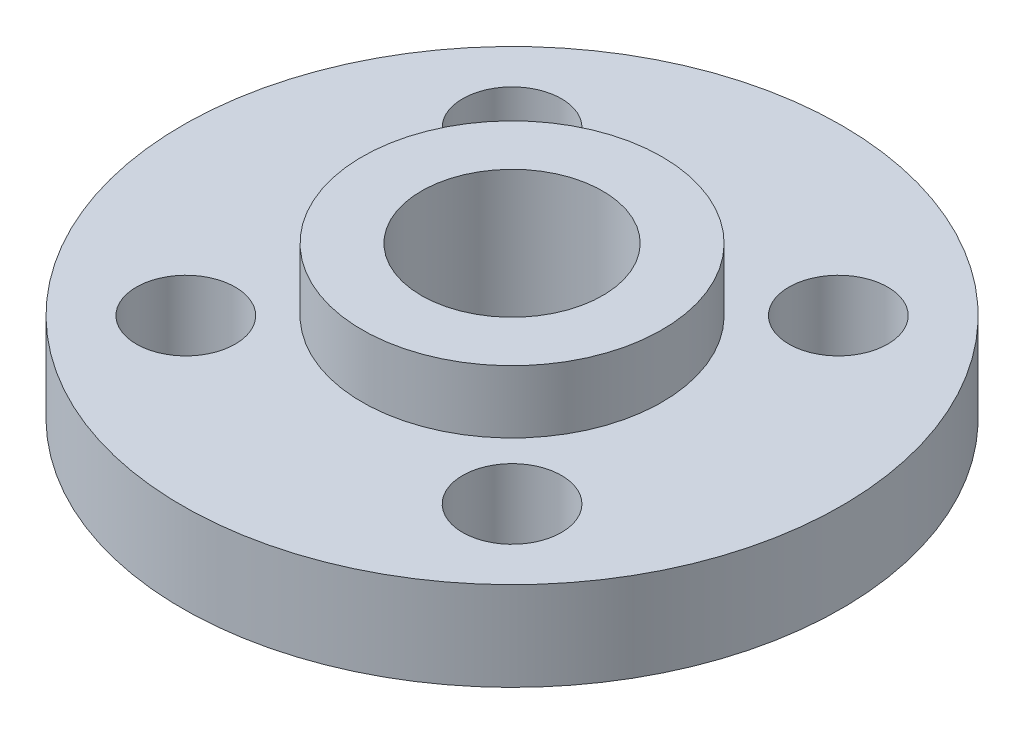
ISO-10303-21;
HEADER;
FILE_DESCRIPTION(('STEP AP214'),'2;1');
FILE_NAME('part.step','',(''),(''),'','','');
FILE_SCHEMA(('AUTOMOTIVE_DESIGN { 1 0 10303 214 1 1 1 1 }'));
ENDSEC;
DATA;
#1=APPLICATION_CONTEXT('core data for automotive mechanical design processes');
#2=APPLICATION_PROTOCOL_DEFINITION('international standard','automotive_design',2000,#1);
#3=PRODUCT_CONTEXT('',#1,'mechanical');
#4=PRODUCT('Part','Part','',(#3));
#5=PRODUCT_RELATED_PRODUCT_CATEGORY('part','',(#4));
#6=PRODUCT_DEFINITION_FORMATION('','',#4);
#7=PRODUCT_DEFINITION_CONTEXT('part definition',#1,'design');
#8=PRODUCT_DEFINITION('design','',#6,#7);
#9=PRODUCT_DEFINITION_SHAPE('','',#8);
#10=(LENGTH_UNIT() NAMED_UNIT(*) SI_UNIT(.MILLI.,.METRE.));
#11=(NAMED_UNIT(*) PLANE_ANGLE_UNIT() SI_UNIT($,.RADIAN.));
#12=(NAMED_UNIT(*) SI_UNIT($,.STERADIAN.) SOLID_ANGLE_UNIT());
#13=UNCERTAINTY_MEASURE_WITH_UNIT(LENGTH_MEASURE(1.E-05),#10,'distance_accuracy_value','');
#14=(GEOMETRIC_REPRESENTATION_CONTEXT(3) GLOBAL_UNCERTAINTY_ASSIGNED_CONTEXT((#13)) GLOBAL_UNIT_ASSIGNED_CONTEXT((#10,
#11,#12)) REPRESENTATION_CONTEXT('',''));
#15=CARTESIAN_POINT('',(0.,0.,0.));
#16=DIRECTION('',(0.,0.,1.));
#17=DIRECTION('',(1.,0.,0.));
#18=AXIS2_PLACEMENT_3D('',#15,#16,#17);
#19=CARTESIAN_POINT('',(0.,2.7,0.));
#20=DIRECTION('',(0.,-1.,0.));
#21=DIRECTION('',(0.,0.,-1.));
#22=AXIS2_PLACEMENT_3D('',#19,#20,#21);
#23=CYLINDRICAL_SURFACE('',#22,1.6);
#24=CARTESIAN_POINT('',(0.,0.,0.));
#25=DIRECTION('',(0.,1.,0.));
#26=DIRECTION('',(0.,0.,1.));
#27=AXIS2_PLACEMENT_3D('',#24,#25,#26);
#28=CIRCLE('',#27,1.6);
#29=CARTESIAN_POINT('',(0.,0.,-1.6));
#30=VERTEX_POINT('',#29);
#31=EDGE_CURVE('E43',#30,#30,#28,.T.);
#32=CARTESIAN_POINT('',(0.,0.6,0.));
#33=DIRECTION('',(0.,1.,0.));
#34=DIRECTION('',(0.,0.,1.));
#35=AXIS2_PLACEMENT_3D('',#32,#33,#34);
#36=CIRCLE('',#35,1.6);
#37=CARTESIAN_POINT('',(0.,0.599999999999999,-1.6));
#38=VERTEX_POINT('',#37);
#39=EDGE_CURVE('E34',#38,#38,#36,.T.);
#40=CARTESIAN_POINT('',(0.,0.,-1.6));
#41=CARTESIAN_POINT('',(0.,0.0062499999999996,-1.6));
#42=CARTESIAN_POINT('',(0.,0.0124999999999996,-1.6));
#43=CARTESIAN_POINT('',(0.,0.0249999999999997,-1.6));
#44=CARTESIAN_POINT('',(0.,0.0312499999999997,-1.6));
#45=CARTESIAN_POINT('',(0.,0.0437499999999997,-1.6));
#46=CARTESIAN_POINT('',(0.,0.0499999999999996,-1.6));
#47=CARTESIAN_POINT('',(0.,0.0624999999999995,-1.6));
#48=CARTESIAN_POINT('',(0.,0.0687499999999995,-1.6));
#49=CARTESIAN_POINT('',(0.,0.0812499999999996,-1.6));
#50=CARTESIAN_POINT('',(0.,0.0874999999999996,-1.6));
#51=CARTESIAN_POINT('',(0.,0.0999999999999995,-1.6));
#52=CARTESIAN_POINT('',(0.,0.106249999999999,-1.6));
#53=CARTESIAN_POINT('',(0.,0.118749999999999,-1.6));
#54=CARTESIAN_POINT('',(0.,0.124999999999999,-1.6));
#55=CARTESIAN_POINT('',(0.,0.137499999999999,-1.6));
#56=CARTESIAN_POINT('',(0.,0.143749999999999,-1.6));
#57=CARTESIAN_POINT('',(0.,0.15625,-1.6));
#58=CARTESIAN_POINT('',(0.,0.1625,-1.6));
#59=CARTESIAN_POINT('',(0.,0.175,-1.6));
#60=CARTESIAN_POINT('',(0.,0.18125,-1.6));
#61=CARTESIAN_POINT('',(0.,0.19375,-1.6));
#62=CARTESIAN_POINT('',(0.,0.2,-1.6));
#63=CARTESIAN_POINT('',(0.,0.212499999999999,-1.6));
#64=CARTESIAN_POINT('',(0.,0.218749999999999,-1.6));
#65=CARTESIAN_POINT('',(0.,0.23125,-1.6));
#66=CARTESIAN_POINT('',(0.,0.2375,-1.6));
#67=CARTESIAN_POINT('',(0.,0.25,-1.6));
#68=CARTESIAN_POINT('',(0.,0.256249999999999,-1.6));
#69=CARTESIAN_POINT('',(0.,0.268749999999999,-1.6));
#70=CARTESIAN_POINT('',(0.,0.274999999999999,-1.6));
#71=CARTESIAN_POINT('',(0.,0.287499999999999,-1.6));
#72=CARTESIAN_POINT('',(0.,0.293749999999999,-1.6));
#73=CARTESIAN_POINT('',(0.,0.30625,-1.6));
#74=CARTESIAN_POINT('',(0.,0.3125,-1.6));
#75=CARTESIAN_POINT('',(0.,0.325,-1.6));
#76=CARTESIAN_POINT('',(0.,0.33125,-1.6));
#77=CARTESIAN_POINT('',(0.,0.34375,-1.6));
#78=CARTESIAN_POINT('',(0.,0.349999999999999,-1.6));
#79=CARTESIAN_POINT('',(0.,0.362499999999999,-1.6));
#80=CARTESIAN_POINT('',(0.,0.368749999999999,-1.6));
#81=CARTESIAN_POINT('',(0.,0.381249999999999,-1.6));
#82=CARTESIAN_POINT('',(0.,0.3875,-1.6));
#83=CARTESIAN_POINT('',(0.,0.399999999999999,-1.6));
#84=CARTESIAN_POINT('',(0.,0.406249999999999,-1.6));
#85=CARTESIAN_POINT('',(0.,0.418749999999999,-1.6));
#86=CARTESIAN_POINT('',(0.,0.424999999999999,-1.6));
#87=CARTESIAN_POINT('',(0.,0.437499999999999,-1.6));
#88=CARTESIAN_POINT('',(0.,0.443749999999999,-1.6));
#89=CARTESIAN_POINT('',(0.,0.456249999999999,-1.6));
#90=CARTESIAN_POINT('',(0.,0.4625,-1.6));
#91=CARTESIAN_POINT('',(0.,0.475,-1.6));
#92=CARTESIAN_POINT('',(0.,0.48125,-1.6));
#93=CARTESIAN_POINT('',(0.,0.49375,-1.6));
#94=CARTESIAN_POINT('',(0.,0.499999999999999,-1.6));
#95=CARTESIAN_POINT('',(0.,0.512499999999999,-1.6));
#96=CARTESIAN_POINT('',(0.,0.518749999999999,-1.6));
#97=CARTESIAN_POINT('',(0.,0.531249999999999,-1.6));
#98=CARTESIAN_POINT('',(0.,0.537499999999999,-1.6));
#99=CARTESIAN_POINT('',(0.,0.549999999999999,-1.6));
#100=CARTESIAN_POINT('',(0.,0.556249999999999,-1.6));
#101=CARTESIAN_POINT('',(0.,0.568749999999999,-1.6));
#102=CARTESIAN_POINT('',(0.,0.574999999999999,-1.6));
#103=CARTESIAN_POINT('',(0.,0.587499999999999,-1.6));
#104=CARTESIAN_POINT('',(0.,0.593749999999999,-1.6));
#105=CARTESIAN_POINT('',(0.,0.599999999999999,-1.6));
#106=B_SPLINE_CURVE_WITH_KNOTS('',3,(#40,#41,#42,#43,#44,#45,#46,#47,#48,#49,#50,#51,#52,#53,
#54,#55,#56,#57,#58,#59,#60,#61,#62,#63,#64,#65,#66,#67,#68,#69,#70,#71,#72,#73,#74,#75,#76,#77,
#78,#79,#80,#81,#82,#83,#84,#85,#86,#87,#88,#89,#90,#91,#92,#93,#94,#95,#96,#97,#98,#99,#100,
#101,#102,#103,#104,#105),.UNSPECIFIED.,.F.,.F.,(4,2,2,2,2,2,2,2,2,2,2,2,2,2,2,2,2,2,2,2,2,2,2,
2,2,2,2,2,2,2,2,2,4),(0.,0.0187500000000001,0.0375000000000002,0.0562499999999999,0.075,
0.0937500000000001,0.1125,0.13125,0.15,0.16875,0.1875,0.20625,0.225,0.24375,0.2625,0.28125,0.3,
0.31875,0.3375,0.35625,0.375,0.39375,0.4125,0.43125,0.45,0.46875,0.4875,0.50625,0.525,0.54375,
0.5625,0.58125,0.6),.UNSPECIFIED.);
#107=EDGE_CURVE('BSEAM30',#30,#38,#106,.T.);
#108=ORIENTED_EDGE('',*,*,#31,.F.);
#109=ORIENTED_EDGE('',*,*,#39,.T.);
#110=ORIENTED_EDGE('',*,*,#107,.T.);
#111=ORIENTED_EDGE('',*,*,#107,.F.);
#112=EDGE_LOOP('',(#108,#110,#109,#111));
#113=FACE_BOUND('',#112,.T.);
#114=ADVANCED_FACE('F30',(#113),#23,.F.);
#115=CARTESIAN_POINT('',(0.,2.7,0.));
#116=DIRECTION('',(0.,1.,0.));
#117=DIRECTION('',(0.,0.,1.));
#118=AXIS2_PLACEMENT_3D('',#115,#116,#117);
#119=PLANE('',#118);
#120=CARTESIAN_POINT('',(4.94974746830583,2.7,4.94974746830583));
#121=DIRECTION('',(0.,1.,0.));
#122=DIRECTION('',(0.,0.,1.));
#123=AXIS2_PLACEMENT_3D('',#120,#121,#122);
#124=CIRCLE('',#123,1.5);
#125=CARTESIAN_POINT('',(4.94974746830583,2.7,6.44974746830583));
#126=VERTEX_POINT('',#125);
#127=EDGE_CURVE('E80',#126,#126,#124,.T.);
#128=ORIENTED_EDGE('',*,*,#127,.F.);
#129=EDGE_LOOP('',(#128));
#130=FACE_BOUND('',#129,.T.);
#131=CARTESIAN_POINT('',(-4.94974746830583,2.7,4.94974746830583));
#132=DIRECTION('',(0.,1.,0.));
#133=DIRECTION('',(0.,0.,1.));
#134=AXIS2_PLACEMENT_3D('',#131,#132,#133);
#135=CIRCLE('',#134,1.5);
#136=CARTESIAN_POINT('',(-4.94974746830583,2.7,6.44974746830583));
#137=VERTEX_POINT('',#136);
#138=EDGE_CURVE('E74',#137,#137,#135,.T.);
#139=ORIENTED_EDGE('',*,*,#138,.F.);
#140=EDGE_LOOP('',(#139));
#141=FACE_BOUND('',#140,.T.);
#142=CARTESIAN_POINT('',(-4.94974746830583,2.7,-4.94974746830583));
#143=DIRECTION('',(0.,1.,0.));
#144=DIRECTION('',(0.,0.,1.));
#145=AXIS2_PLACEMENT_3D('',#142,#143,#144);
#146=CIRCLE('',#145,1.5);
#147=CARTESIAN_POINT('',(-4.94974746830583,2.7,-3.44974746830583));
#148=VERTEX_POINT('',#147);
#149=EDGE_CURVE('E68',#148,#148,#146,.T.);
#150=ORIENTED_EDGE('',*,*,#149,.F.);
#151=EDGE_LOOP('',(#150));
#152=FACE_BOUND('',#151,.T.);
#153=CARTESIAN_POINT('',(4.94974746830583,2.7,-4.94974746830583));
#154=DIRECTION('',(0.,1.,0.));
#155=DIRECTION('',(0.,0.,1.));
#156=AXIS2_PLACEMENT_3D('',#153,#154,#155);
#157=CIRCLE('',#156,1.5);
#158=CARTESIAN_POINT('',(4.94974746830583,2.7,-3.44974746830583));
#159=VERTEX_POINT('',#158);
#160=EDGE_CURVE('E62',#159,#159,#157,.T.);
#161=ORIENTED_EDGE('',*,*,#160,.F.);
#162=EDGE_LOOP('',(#161));
#163=FACE_BOUND('',#162,.T.);
#164=CARTESIAN_POINT('',(0.,2.7,0.));
#165=DIRECTION('',(0.,1.,0.));
#166=DIRECTION('',(0.,0.,1.));
#167=AXIS2_PLACEMENT_3D('',#164,#165,#166);
#168=CIRCLE('',#167,4.55);
#169=CARTESIAN_POINT('',(0.,2.7,-4.55));
#170=VERTEX_POINT('',#169);
#171=EDGE_CURVE('E48',#170,#170,#168,.T.);
#172=ORIENTED_EDGE('',*,*,#171,.F.);
#173=EDGE_LOOP('',(#172));
#174=FACE_BOUND('',#173,.T.);
#175=CARTESIAN_POINT('',(0.,2.7,0.));
#176=DIRECTION('',(0.,1.,0.));
#177=DIRECTION('',(0.,0.,1.));
#178=AXIS2_PLACEMENT_3D('',#175,#176,#177);
#179=CIRCLE('',#178,10.);
#180=CARTESIAN_POINT('',(0.,2.7,-10.));
#181=VERTEX_POINT('',#180);
#182=EDGE_CURVE('E10',#181,#181,#179,.T.);
#183=ORIENTED_EDGE('',*,*,#182,.T.);
#184=EDGE_LOOP('',(#183));
#185=FACE_BOUND('',#184,.T.);
#186=ADVANCED_FACE('F86',(#130,#141,#152,#163,#174,#185),#119,.T.);
#187=CARTESIAN_POINT('',(0.,0.,0.));
#188=DIRECTION('',(0.,1.,0.));
#189=DIRECTION('',(0.,0.,1.));
#190=AXIS2_PLACEMENT_3D('',#187,#188,#189);
#191=PLANE('',#190);
#192=CARTESIAN_POINT('',(4.94974746830583,0.,4.94974746830583));
#193=DIRECTION('',(0.,1.,0.));
#194=DIRECTION('',(0.,0.,1.));
#195=AXIS2_PLACEMENT_3D('',#192,#193,#194);
#196=CIRCLE('',#195,1.5);
#197=CARTESIAN_POINT('',(4.94974746830583,0.,6.44974746830583));
#198=VERTEX_POINT('',#197);
#199=EDGE_CURVE('E77',#198,#198,#196,.T.);
#200=ORIENTED_EDGE('',*,*,#199,.T.);
#201=EDGE_LOOP('',(#200));
#202=FACE_BOUND('',#201,.T.);
#203=CARTESIAN_POINT('',(-4.94974746830583,0.,4.94974746830583));
#204=DIRECTION('',(0.,1.,0.));
#205=DIRECTION('',(0.,0.,1.));
#206=AXIS2_PLACEMENT_3D('',#203,#204,#205);
#207=CIRCLE('',#206,1.5);
#208=CARTESIAN_POINT('',(-4.94974746830583,0.,6.44974746830583));
#209=VERTEX_POINT('',#208);
#210=EDGE_CURVE('E71',#209,#209,#207,.T.);
#211=ORIENTED_EDGE('',*,*,#210,.T.);
#212=EDGE_LOOP('',(#211));
#213=FACE_BOUND('',#212,.T.);
#214=CARTESIAN_POINT('',(-4.94974746830583,0.,-4.94974746830583));
#215=DIRECTION('',(0.,1.,0.));
#216=DIRECTION('',(0.,0.,1.));
#217=AXIS2_PLACEMENT_3D('',#214,#215,#216);
#218=CIRCLE('',#217,1.5);
#219=CARTESIAN_POINT('',(-4.94974746830583,0.,-3.44974746830583));
#220=VERTEX_POINT('',#219);
#221=EDGE_CURVE('E65',#220,#220,#218,.T.);
#222=ORIENTED_EDGE('',*,*,#221,.T.);
#223=EDGE_LOOP('',(#222));
#224=FACE_BOUND('',#223,.T.);
#225=CARTESIAN_POINT('',(4.94974746830583,0.,-4.94974746830583));
#226=DIRECTION('',(0.,1.,0.));
#227=DIRECTION('',(0.,0.,1.));
#228=AXIS2_PLACEMENT_3D('',#225,#226,#227);
#229=CIRCLE('',#228,1.5);
#230=CARTESIAN_POINT('',(4.94974746830583,0.,-3.44974746830583));
#231=VERTEX_POINT('',#230);
#232=EDGE_CURVE('E57',#231,#231,#229,.T.);
#233=ORIENTED_EDGE('',*,*,#232,.T.);
#234=EDGE_LOOP('',(#233));
#235=FACE_BOUND('',#234,.T.);
#236=CARTESIAN_POINT('',(0.,0.,0.));
#237=DIRECTION('',(0.,1.,0.));
#238=DIRECTION('',(0.,0.,1.));
#239=AXIS2_PLACEMENT_3D('',#236,#237,#238);
#240=CIRCLE('',#239,10.);
#241=CARTESIAN_POINT('',(0.,0.,-10.));
#242=VERTEX_POINT('',#241);
#243=EDGE_CURVE('E38',#242,#242,#240,.T.);
#244=ORIENTED_EDGE('',*,*,#243,.F.);
#245=EDGE_LOOP('',(#244));
#246=FACE_BOUND('',#245,.T.);
#247=ORIENTED_EDGE('',*,*,#31,.T.);
#248=EDGE_LOOP('',(#247));
#249=FACE_BOUND('',#248,.T.);
#250=ADVANCED_FACE('F89',(#202,#213,#224,#235,#246,#249),#191,.F.);
#251=CARTESIAN_POINT('',(0.,2.7,0.));
#252=DIRECTION('',(0.,-1.,0.));
#253=DIRECTION('',(0.,0.,-1.));
#254=AXIS2_PLACEMENT_3D('',#251,#252,#253);
#255=CYLINDRICAL_SURFACE('',#254,10.);
#256=CARTESIAN_POINT('',(0.,2.7,-10.));
#257=CARTESIAN_POINT('',(0.,2.671875,-10.));
#258=CARTESIAN_POINT('',(0.,2.64375,-10.));
#259=CARTESIAN_POINT('',(0.,2.5875,-10.));
#260=CARTESIAN_POINT('',(0.,2.559375,-10.));
#261=CARTESIAN_POINT('',(0.,2.503125,-10.));
#262=CARTESIAN_POINT('',(0.,2.475,-10.));
#263=CARTESIAN_POINT('',(0.,2.41875,-10.));
#264=CARTESIAN_POINT('',(0.,2.390625,-10.));
#265=CARTESIAN_POINT('',(0.,2.334375,-10.));
#266=CARTESIAN_POINT('',(0.,2.30625,-10.));
#267=CARTESIAN_POINT('',(0.,2.25,-10.));
#268=CARTESIAN_POINT('',(0.,2.221875,-10.));
#269=CARTESIAN_POINT('',(0.,2.165625,-10.));
#270=CARTESIAN_POINT('',(0.,2.1375,-10.));
#271=CARTESIAN_POINT('',(0.,2.08125,-10.));
#272=CARTESIAN_POINT('',(0.,2.053125,-10.));
#273=CARTESIAN_POINT('',(0.,1.996875,-10.));
#274=CARTESIAN_POINT('',(0.,1.96875,-10.));
#275=CARTESIAN_POINT('',(0.,1.9125,-10.));
#276=CARTESIAN_POINT('',(0.,1.884375,-10.));
#277=CARTESIAN_POINT('',(0.,1.828125,-10.));
#278=CARTESIAN_POINT('',(0.,1.8,-10.));
#279=CARTESIAN_POINT('',(0.,1.74375,-10.));
#280=CARTESIAN_POINT('',(0.,1.715625,-10.));
#281=CARTESIAN_POINT('',(0.,1.659375,-10.));
#282=CARTESIAN_POINT('',(0.,1.63125,-10.));
#283=CARTESIAN_POINT('',(0.,1.575,-10.));
#284=CARTESIAN_POINT('',(0.,1.546875,-10.));
#285=CARTESIAN_POINT('',(0.,1.490625,-10.));
#286=CARTESIAN_POINT('',(0.,1.4625,-10.));
#287=CARTESIAN_POINT('',(0.,1.40625,-10.));
#288=CARTESIAN_POINT('',(0.,1.378125,-10.));
#289=CARTESIAN_POINT('',(0.,1.321875,-10.));
#290=CARTESIAN_POINT('',(0.,1.29375,-10.));
#291=CARTESIAN_POINT('',(0.,1.2375,-10.));
#292=CARTESIAN_POINT('',(0.,1.209375,-10.));
#293=CARTESIAN_POINT('',(0.,1.153125,-10.));
#294=CARTESIAN_POINT('',(0.,1.125,-10.));
#295=CARTESIAN_POINT('',(0.,1.06875,-10.));
#296=CARTESIAN_POINT('',(0.,1.040625,-10.));
#297=CARTESIAN_POINT('',(0.,0.984375,-10.));
#298=CARTESIAN_POINT('',(0.,0.956249999999999,-10.));
#299=CARTESIAN_POINT('',(0.,0.899999999999999,-10.));
#300=CARTESIAN_POINT('',(0.,0.871875,-10.));
#301=CARTESIAN_POINT('',(0.,0.815624999999999,-10.));
#302=CARTESIAN_POINT('',(0.,0.787499999999999,-10.));
#303=CARTESIAN_POINT('',(0.,0.73125,-10.));
#304=CARTESIAN_POINT('',(0.,0.703125,-10.));
#305=CARTESIAN_POINT('',(0.,0.646875,-10.));
#306=CARTESIAN_POINT('',(0.,0.61875,-10.));
#307=CARTESIAN_POINT('',(0.,0.5625,-10.));
#308=CARTESIAN_POINT('',(0.,0.534375,-10.));
#309=CARTESIAN_POINT('',(0.,0.478125,-10.));
#310=CARTESIAN_POINT('',(0.,0.45,-10.));
#311=CARTESIAN_POINT('',(0.,0.39375,-10.));
#312=CARTESIAN_POINT('',(0.,0.365625,-10.));
#313=CARTESIAN_POINT('',(0.,0.309375,-10.));
#314=CARTESIAN_POINT('',(0.,0.28125,-10.));
#315=CARTESIAN_POINT('',(0.,0.225,-10.));
#316=CARTESIAN_POINT('',(0.,0.196875,-10.));
#317=CARTESIAN_POINT('',(0.,0.140625,-10.));
#318=CARTESIAN_POINT('',(0.,0.1125,-10.));
#319=CARTESIAN_POINT('',(0.,0.0562499999999997,-10.));
#320=CARTESIAN_POINT('',(0.,0.0281249999999996,-10.));
#321=CARTESIAN_POINT('',(0.,0.,-10.));
#322=B_SPLINE_CURVE_WITH_KNOTS('',3,(#256,#257,#258,#259,#260,#261,#262,#263,#264,#265,#266,
#267,#268,#269,#270,#271,#272,#273,#274,#275,#276,#277,#278,#279,#280,#281,#282,#283,#284,#285,
#286,#287,#288,#289,#290,#291,#292,#293,#294,#295,#296,#297,#298,#299,#300,#301,#302,#303,#304,
#305,#306,#307,#308,#309,#310,#311,#312,#313,#314,#315,#316,#317,#318,#319,#320,#321),
.UNSPECIFIED.,.F.,.F.,(4,2,2,2,2,2,2,2,2,2,2,2,2,2,2,2,2,2,2,2,2,2,2,2,2,2,2,2,2,2,2,2,4),(0.,
0.0843750000000003,0.16875,0.253125,0.3375,0.421875,0.50625,0.590625,0.675,0.759375,0.84375,
0.928125000000001,1.0125,1.096875,1.18125,1.265625,1.35,1.434375,1.51875,1.603125,1.6875,
1.771875,1.85625,1.940625,2.025,2.109375,2.19375,2.278125,2.3625,2.446875,2.53125,2.615625,2.7),.UNSPECIFIED.);
#323=EDGE_CURVE('BSEAM32',#181,#242,#322,.T.);
#324=ORIENTED_EDGE('',*,*,#182,.F.);
#325=ORIENTED_EDGE('',*,*,#243,.T.);
#326=ORIENTED_EDGE('',*,*,#323,.T.);
#327=ORIENTED_EDGE('',*,*,#323,.F.);
#328=EDGE_LOOP('',(#324,#326,#325,#327));
#329=FACE_BOUND('',#328,.T.);
#330=ADVANCED_FACE('F32',(#329),#255,.T.);
#331=CARTESIAN_POINT('',(0.,4.6,0.));
#332=DIRECTION('',(0.,-1.,0.));
#333=DIRECTION('',(0.,0.,-1.));
#334=AXIS2_PLACEMENT_3D('',#331,#332,#333);
#335=CYLINDRICAL_SURFACE('',#334,4.55);
#336=CARTESIAN_POINT('',(0.,4.6,0.));
#337=DIRECTION('',(0.,1.,0.));
#338=DIRECTION('',(0.,0.,1.));
#339=AXIS2_PLACEMENT_3D('',#336,#337,#338);
#340=CIRCLE('',#339,4.55);
#341=CARTESIAN_POINT('',(0.,4.6,-4.55));
#342=VERTEX_POINT('',#341);
#343=EDGE_CURVE('E47',#342,#342,#340,.T.);
#344=CARTESIAN_POINT('',(0.,4.6,-4.55));
#345=CARTESIAN_POINT('',(0.,4.58020833333333,-4.55));
#346=CARTESIAN_POINT('',(0.,4.56041666666667,-4.55));
#347=CARTESIAN_POINT('',(0.,4.52083333333333,-4.55));
#348=CARTESIAN_POINT('',(0.,4.50104166666667,-4.55));
#349=CARTESIAN_POINT('',(0.,4.46145833333333,-4.55));
#350=CARTESIAN_POINT('',(0.,4.44166666666667,-4.55));
#351=CARTESIAN_POINT('',(0.,4.40208333333333,-4.55));
#352=CARTESIAN_POINT('',(0.,4.38229166666667,-4.55));
#353=CARTESIAN_POINT('',(0.,4.34270833333333,-4.55));
#354=CARTESIAN_POINT('',(0.,4.32291666666667,-4.55));
#355=CARTESIAN_POINT('',(0.,4.28333333333333,-4.55));
#356=CARTESIAN_POINT('',(0.,4.26354166666667,-4.55));
#357=CARTESIAN_POINT('',(0.,4.22395833333333,-4.55));
#358=CARTESIAN_POINT('',(0.,4.20416666666667,-4.55));
#359=CARTESIAN_POINT('',(0.,4.16458333333333,-4.55));
#360=CARTESIAN_POINT('',(0.,4.14479166666667,-4.55));
#361=CARTESIAN_POINT('',(0.,4.10520833333333,-4.55));
#362=CARTESIAN_POINT('',(0.,4.08541666666667,-4.55));
#363=CARTESIAN_POINT('',(0.,4.04583333333333,-4.55));
#364=CARTESIAN_POINT('',(0.,4.02604166666667,-4.55));
#365=CARTESIAN_POINT('',(0.,3.98645833333333,-4.55));
#366=CARTESIAN_POINT('',(0.,3.96666666666667,-4.55));
#367=CARTESIAN_POINT('',(0.,3.92708333333333,-4.55));
#368=CARTESIAN_POINT('',(0.,3.90729166666667,-4.55));
#369=CARTESIAN_POINT('',(0.,3.86770833333333,-4.55));
#370=CARTESIAN_POINT('',(0.,3.84791666666667,-4.55));
#371=CARTESIAN_POINT('',(0.,3.80833333333333,-4.55));
#372=CARTESIAN_POINT('',(0.,3.78854166666667,-4.55));
#373=CARTESIAN_POINT('',(0.,3.74895833333333,-4.55));
#374=CARTESIAN_POINT('',(0.,3.72916666666667,-4.55));
#375=CARTESIAN_POINT('',(0.,3.68958333333333,-4.55));
#376=CARTESIAN_POINT('',(0.,3.66979166666667,-4.55));
#377=CARTESIAN_POINT('',(0.,3.63020833333333,-4.55));
#378=CARTESIAN_POINT('',(0.,3.61041666666667,-4.55));
#379=CARTESIAN_POINT('',(0.,3.57083333333333,-4.55));
#380=CARTESIAN_POINT('',(0.,3.55104166666667,-4.55));
#381=CARTESIAN_POINT('',(0.,3.51145833333333,-4.55));
#382=CARTESIAN_POINT('',(0.,3.49166666666667,-4.55));
#383=CARTESIAN_POINT('',(0.,3.45208333333333,-4.55));
#384=CARTESIAN_POINT('',(0.,3.43229166666667,-4.55));
#385=CARTESIAN_POINT('',(0.,3.39270833333333,-4.55));
#386=CARTESIAN_POINT('',(0.,3.37291666666667,-4.55));
#387=CARTESIAN_POINT('',(0.,3.33333333333333,-4.55));
#388=CARTESIAN_POINT('',(0.,3.31354166666667,-4.55));
#389=CARTESIAN_POINT('',(0.,3.27395833333333,-4.55));
#390=CARTESIAN_POINT('',(0.,3.25416666666667,-4.55));
#391=CARTESIAN_POINT('',(0.,3.21458333333333,-4.55));
#392=CARTESIAN_POINT('',(0.,3.19479166666667,-4.55));
#393=CARTESIAN_POINT('',(0.,3.15520833333333,-4.55));
#394=CARTESIAN_POINT('',(0.,3.13541666666667,-4.55));
#395=CARTESIAN_POINT('',(0.,3.09583333333333,-4.55));
#396=CARTESIAN_POINT('',(0.,3.07604166666667,-4.55));
#397=CARTESIAN_POINT('',(0.,3.03645833333333,-4.55));
#398=CARTESIAN_POINT('',(0.,3.01666666666667,-4.55));
#399=CARTESIAN_POINT('',(0.,2.97708333333333,-4.55));
#400=CARTESIAN_POINT('',(0.,2.95729166666667,-4.55));
#401=CARTESIAN_POINT('',(0.,2.91770833333333,-4.55));
#402=CARTESIAN_POINT('',(0.,2.89791666666667,-4.55));
#403=CARTESIAN_POINT('',(0.,2.85833333333333,-4.55));
#404=CARTESIAN_POINT('',(0.,2.83854166666667,-4.55));
#405=CARTESIAN_POINT('',(0.,2.79895833333333,-4.55));
#406=CARTESIAN_POINT('',(0.,2.77916666666667,-4.55));
#407=CARTESIAN_POINT('',(0.,2.73958333333333,-4.55));
#408=CARTESIAN_POINT('',(0.,2.71979166666667,-4.55));
#409=CARTESIAN_POINT('',(0.,2.7,-4.55));
#410=B_SPLINE_CURVE_WITH_KNOTS('',3,(#344,#345,#346,#347,#348,#349,#350,#351,#352,#353,#354,
#355,#356,#357,#358,#359,#360,#361,#362,#363,#364,#365,#366,#367,#368,#369,#370,#371,#372,#373,
#374,#375,#376,#377,#378,#379,#380,#381,#382,#383,#384,#385,#386,#387,#388,#389,#390,#391,#392,
#393,#394,#395,#396,#397,#398,#399,#400,#401,#402,#403,#404,#405,#406,#407,#408,#409),
.UNSPECIFIED.,.F.,.F.,(4,2,2,2,2,2,2,2,2,2,2,2,2,2,2,2,2,2,2,2,2,2,2,2,2,2,2,2,2,2,2,2,4),(0.,
0.0593749999999995,0.11875,0.178124999999999,0.2375,0.296874999999999,0.35625,0.415624999999999,
0.475,0.534374999999999,0.59375,0.653124999999999,0.7125,0.771874999999999,0.831249999999999,
0.890624999999999,0.95,1.009375,1.06875,1.128125,1.1875,1.246875,1.30625,1.365625,1.425,
1.484375,1.54375,1.603125,1.6625,1.721875,1.78125,1.840625,1.9),.UNSPECIFIED.);
#411=EDGE_CURVE('BSEAM99',#342,#170,#410,.T.);
#412=ORIENTED_EDGE('',*,*,#343,.F.);
#413=ORIENTED_EDGE('',*,*,#171,.T.);
#414=ORIENTED_EDGE('',*,*,#411,.T.);
#415=ORIENTED_EDGE('',*,*,#411,.F.);
#416=EDGE_LOOP('',(#412,#414,#413,#415));
#417=FACE_BOUND('',#416,.T.);
#418=ADVANCED_FACE('F99',(#417),#335,.T.);
#419=CARTESIAN_POINT('',(0.,4.6,0.));
#420=DIRECTION('',(0.,1.,0.));
#421=DIRECTION('',(0.,0.,1.));
#422=AXIS2_PLACEMENT_3D('',#419,#420,#421);
#423=PLANE('',#422);
#424=CARTESIAN_POINT('',(0.,4.6,0.));
#425=DIRECTION('',(0.,1.,0.));
#426=DIRECTION('',(0.,0.,1.));
#427=AXIS2_PLACEMENT_3D('',#424,#425,#426);
#428=CIRCLE('',#427,2.75);
#429=CARTESIAN_POINT('',(0.,4.6,2.75));
#430=VERTEX_POINT('',#429);
#431=EDGE_CURVE('E53',#430,#430,#428,.T.);
#432=ORIENTED_EDGE('',*,*,#431,.F.);
#433=EDGE_LOOP('',(#432));
#434=FACE_BOUND('',#433,.T.);
#435=ORIENTED_EDGE('',*,*,#343,.T.);
#436=EDGE_LOOP('',(#435));
#437=FACE_BOUND('',#436,.T.);
#438=ADVANCED_FACE('F101',(#434,#437),#423,.T.);
#439=CARTESIAN_POINT('',(0.,0.6,0.));
#440=DIRECTION('',(0.,1.,0.));
#441=DIRECTION('',(0.,0.,1.));
#442=AXIS2_PLACEMENT_3D('',#439,#440,#441);
#443=CYLINDRICAL_SURFACE('',#442,2.75);
#444=CARTESIAN_POINT('',(0.,0.6,0.));
#445=DIRECTION('',(0.,1.,0.));
#446=DIRECTION('',(0.,0.,1.));
#447=AXIS2_PLACEMENT_3D('',#444,#445,#446);
#448=CIRCLE('',#447,2.75);
#449=CARTESIAN_POINT('',(0.,0.6,2.75));
#450=VERTEX_POINT('',#449);
#451=EDGE_CURVE('E56',#450,#450,#448,.T.);
#452=ORIENTED_EDGE('',*,*,#451,.F.);
#453=EDGE_LOOP('',(#452));
#454=FACE_BOUND('',#453,.T.);
#455=ORIENTED_EDGE('',*,*,#431,.T.);
#456=EDGE_LOOP('',(#455));
#457=FACE_BOUND('',#456,.T.);
#458=ADVANCED_FACE('F108',(#454,#457),#443,.F.);
#459=CARTESIAN_POINT('',(0.,0.6,0.));
#460=DIRECTION('',(0.,1.,0.));
#461=DIRECTION('',(0.,0.,1.));
#462=AXIS2_PLACEMENT_3D('',#459,#460,#461);
#463=PLANE('',#462);
#464=ORIENTED_EDGE('',*,*,#39,.F.);
#465=EDGE_LOOP('',(#464));
#466=FACE_BOUND('',#465,.T.);
#467=ORIENTED_EDGE('',*,*,#451,.T.);
#468=EDGE_LOOP('',(#467));
#469=FACE_BOUND('',#468,.T.);
#470=ADVANCED_FACE('F140',(#466,#469),#463,.T.);
#471=CARTESIAN_POINT('',(4.94974746830583,2.7,-4.94974746830583));
#472=DIRECTION('',(0.,1.,0.));
#473=DIRECTION('',(0.,0.,1.));
#474=AXIS2_PLACEMENT_3D('',#471,#472,#473);
#475=CYLINDRICAL_SURFACE('',#474,1.5);
#476=ORIENTED_EDGE('',*,*,#232,.F.);
#477=EDGE_LOOP('',(#476));
#478=FACE_BOUND('',#477,.T.);
#479=ORIENTED_EDGE('',*,*,#160,.T.);
#480=EDGE_LOOP('',(#479));
#481=FACE_BOUND('',#480,.T.);
#482=ADVANCED_FACE('F136',(#478,#481),#475,.F.);
#483=CARTESIAN_POINT('',(-4.94974746830583,2.7,-4.94974746830583));
#484=DIRECTION('',(0.,1.,0.));
#485=DIRECTION('',(0.,0.,1.));
#486=AXIS2_PLACEMENT_3D('',#483,#484,#485);
#487=CYLINDRICAL_SURFACE('',#486,1.5);
#488=ORIENTED_EDGE('',*,*,#221,.F.);
#489=EDGE_LOOP('',(#488));
#490=FACE_BOUND('',#489,.T.);
#491=ORIENTED_EDGE('',*,*,#149,.T.);
#492=EDGE_LOOP('',(#491));
#493=FACE_BOUND('',#492,.T.);
#494=ADVANCED_FACE('F139',(#490,#493),#487,.F.);
#495=CARTESIAN_POINT('',(-4.94974746830583,2.7,4.94974746830583));
#496=DIRECTION('',(0.,1.,0.));
#497=DIRECTION('',(0.,0.,1.));
#498=AXIS2_PLACEMENT_3D('',#495,#496,#497);
#499=CYLINDRICAL_SURFACE('',#498,1.5);
#500=ORIENTED_EDGE('',*,*,#210,.F.);
#501=EDGE_LOOP('',(#500));
#502=FACE_BOUND('',#501,.T.);
#503=ORIENTED_EDGE('',*,*,#138,.T.);
#504=EDGE_LOOP('',(#503));
#505=FACE_BOUND('',#504,.T.);
#506=ADVANCED_FACE('F146',(#502,#505),#499,.F.);
#507=CARTESIAN_POINT('',(4.94974746830583,2.7,4.94974746830583));
#508=DIRECTION('',(0.,1.,0.));
#509=DIRECTION('',(0.,0.,1.));
#510=AXIS2_PLACEMENT_3D('',#507,#508,#509);
#511=CYLINDRICAL_SURFACE('',#510,1.5);
#512=ORIENTED_EDGE('',*,*,#199,.F.);
#513=EDGE_LOOP('',(#512));
#514=FACE_BOUND('',#513,.T.);
#515=ORIENTED_EDGE('',*,*,#127,.T.);
#516=EDGE_LOOP('',(#515));
#517=FACE_BOUND('',#516,.T.);
#518=ADVANCED_FACE('F84',(#514,#517),#511,.F.);
#519=CLOSED_SHELL('',(#114,#186,#250,#330,#418,#438,#458,#470,#482,#494,#506,#518));
#520=MANIFOLD_SOLID_BREP('B2',#519);
#521=ADVANCED_BREP_SHAPE_REPRESENTATION('',(#18,#520),#14);
#522=SHAPE_DEFINITION_REPRESENTATION(#9,#521);
ENDSEC;
END-ISO-10303-21;
